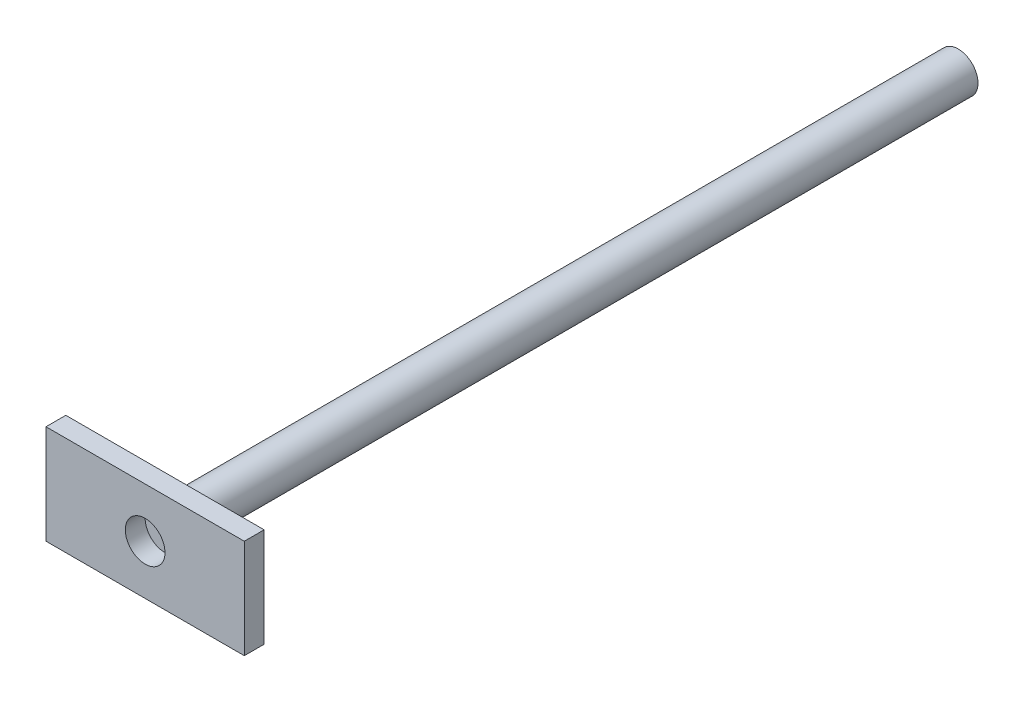
ISO-10303-21;
HEADER;
FILE_DESCRIPTION(('STEP AP214'),'2;1');
FILE_NAME('part.step','',(''),(''),'','','');
FILE_SCHEMA(('AUTOMOTIVE_DESIGN { 1 0 10303 214 1 1 1 1 }'));
ENDSEC;
DATA;
#1=APPLICATION_CONTEXT('core data for automotive mechanical design processes');
#2=APPLICATION_PROTOCOL_DEFINITION('international standard','automotive_design',2000,#1);
#3=PRODUCT_CONTEXT('',#1,'mechanical');
#4=PRODUCT('Part','Part','',(#3));
#5=PRODUCT_RELATED_PRODUCT_CATEGORY('part','',(#4));
#6=PRODUCT_DEFINITION_FORMATION('','',#4);
#7=PRODUCT_DEFINITION_CONTEXT('part definition',#1,'design');
#8=PRODUCT_DEFINITION('design','',#6,#7);
#9=PRODUCT_DEFINITION_SHAPE('','',#8);
#10=(LENGTH_UNIT() NAMED_UNIT(*) SI_UNIT(.MILLI.,.METRE.));
#11=(NAMED_UNIT(*) PLANE_ANGLE_UNIT() SI_UNIT($,.RADIAN.));
#12=(NAMED_UNIT(*) SI_UNIT($,.STERADIAN.) SOLID_ANGLE_UNIT());
#13=UNCERTAINTY_MEASURE_WITH_UNIT(LENGTH_MEASURE(1.E-05),#10,'distance_accuracy_value','');
#14=(GEOMETRIC_REPRESENTATION_CONTEXT(3) GLOBAL_UNCERTAINTY_ASSIGNED_CONTEXT((#13)) GLOBAL_UNIT_ASSIGNED_CONTEXT((#10,
#11,#12)) REPRESENTATION_CONTEXT('',''));
#15=CARTESIAN_POINT('',(0.,0.,0.));
#16=DIRECTION('',(0.,0.,1.));
#17=DIRECTION('',(1.,0.,0.));
#18=AXIS2_PLACEMENT_3D('',#15,#16,#17);
#19=CARTESIAN_POINT('',(-50.,25.,410.));
#20=DIRECTION('',(0.,0.,1.));
#21=DIRECTION('',(1.,0.,0.));
#22=AXIS2_PLACEMENT_3D('',#19,#20,#21);
#23=PLANE('',#22);
#24=DIRECTION('',(0.,-1.,0.));
#25=VECTOR('',#24,1.);
#26=CARTESIAN_POINT('',(-50.,-25.,410.));
#27=LINE('',#26,#25);
#28=CARTESIAN_POINT('',(-50.,25.,410.));
#29=VERTEX_POINT('',#28);
#30=CARTESIAN_POINT('',(-50.,-25.,410.));
#31=VERTEX_POINT('',#30);
#32=EDGE_CURVE('E92',#29,#31,#27,.T.);
#33=ORIENTED_EDGE('',*,*,#32,.T.);
#34=DIRECTION('',(1.,0.,0.));
#35=VECTOR('',#34,1.);
#36=CARTESIAN_POINT('',(50.,-25.,410.));
#37=LINE('',#36,#35);
#38=CARTESIAN_POINT('',(50.,-25.,410.));
#39=VERTEX_POINT('',#38);
#40=EDGE_CURVE('E87',#31,#39,#37,.T.);
#41=ORIENTED_EDGE('',*,*,#40,.T.);
#42=DIRECTION('',(0.,1.,0.));
#43=VECTOR('',#42,1.);
#44=CARTESIAN_POINT('',(50.,-25.,410.));
#45=LINE('',#44,#43);
#46=CARTESIAN_POINT('',(50.,25.,410.));
#47=VERTEX_POINT('',#46);
#48=EDGE_CURVE('E90',#39,#47,#45,.T.);
#49=ORIENTED_EDGE('',*,*,#48,.T.);
#50=DIRECTION('',(-1.,0.,0.));
#51=VECTOR('',#50,1.);
#52=CARTESIAN_POINT('',(50.,25.,410.));
#53=LINE('',#52,#51);
#54=EDGE_CURVE('E57',#47,#29,#53,.T.);
#55=ORIENTED_EDGE('',*,*,#54,.T.);
#56=EDGE_LOOP('',(#33,#41,#49,#55));
#57=FACE_BOUND('',#56,.T.);
#58=CARTESIAN_POINT('',(0.,0.,410.));
#59=DIRECTION('',(0.,0.,1.));
#60=DIRECTION('',(1.,0.,0.));
#61=AXIS2_PLACEMENT_3D('',#58,#59,#60);
#62=CIRCLE('',#61,9.99999999999999);
#63=CARTESIAN_POINT('',(9.99999999999999,0.,410.));
#64=VERTEX_POINT('',#63);
#65=EDGE_CURVE('E107',#64,#64,#62,.T.);
#66=ORIENTED_EDGE('',*,*,#65,.F.);
#67=EDGE_LOOP('',(#66));
#68=FACE_BOUND('',#67,.T.);
#69=ADVANCED_FACE('F40',(#57,#68),#23,.T.);
#70=CARTESIAN_POINT('',(-50.,25.,400.));
#71=DIRECTION('',(0.,0.,1.));
#72=DIRECTION('',(1.,0.,0.));
#73=AXIS2_PLACEMENT_3D('',#70,#71,#72);
#74=PLANE('',#73);
#75=DIRECTION('',(0.,-1.,0.));
#76=VECTOR('',#75,1.);
#77=CARTESIAN_POINT('',(-50.,-25.,400.));
#78=LINE('',#77,#76);
#79=CARTESIAN_POINT('',(-50.,25.,400.));
#80=VERTEX_POINT('',#79);
#81=CARTESIAN_POINT('',(-50.,-25.,400.));
#82=VERTEX_POINT('',#81);
#83=EDGE_CURVE('E104',#80,#82,#78,.T.);
#84=ORIENTED_EDGE('',*,*,#83,.F.);
#85=DIRECTION('',(-1.,0.,0.));
#86=VECTOR('',#85,1.);
#87=CARTESIAN_POINT('',(50.,25.,400.));
#88=LINE('',#87,#86);
#89=CARTESIAN_POINT('',(50.,25.,400.));
#90=VERTEX_POINT('',#89);
#91=EDGE_CURVE('E80',#90,#80,#88,.T.);
#92=ORIENTED_EDGE('',*,*,#91,.F.);
#93=DIRECTION('',(0.,1.,0.));
#94=VECTOR('',#93,1.);
#95=CARTESIAN_POINT('',(50.,-25.,400.));
#96=LINE('',#95,#94);
#97=CARTESIAN_POINT('',(50.,-25.,400.));
#98=VERTEX_POINT('',#97);
#99=EDGE_CURVE('E74',#98,#90,#96,.T.);
#100=ORIENTED_EDGE('',*,*,#99,.F.);
#101=DIRECTION('',(1.,0.,0.));
#102=VECTOR('',#101,1.);
#103=CARTESIAN_POINT('',(50.,-25.,400.));
#104=LINE('',#103,#102);
#105=EDGE_CURVE('E96',#82,#98,#104,.T.);
#106=ORIENTED_EDGE('',*,*,#105,.F.);
#107=EDGE_LOOP('',(#84,#92,#100,#106));
#108=FACE_BOUND('',#107,.T.);
#109=CARTESIAN_POINT('',(0.,0.,400.));
#110=DIRECTION('',(0.,0.,1.));
#111=DIRECTION('',(1.,0.,0.));
#112=AXIS2_PLACEMENT_3D('',#109,#110,#111);
#113=CIRCLE('',#112,9.99999999999999);
#114=CARTESIAN_POINT('',(9.99999999999999,0.,400.));
#115=VERTEX_POINT('',#114);
#116=EDGE_CURVE('E119',#115,#115,#113,.T.);
#117=ORIENTED_EDGE('',*,*,#116,.T.);
#118=EDGE_LOOP('',(#117));
#119=FACE_BOUND('',#118,.T.);
#120=ADVANCED_FACE('F115',(#108,#119),#74,.F.);
#121=CARTESIAN_POINT('',(-50.,-25.,410.));
#122=DIRECTION('',(1.,0.,0.));
#123=DIRECTION('',(0.,0.,-1.));
#124=AXIS2_PLACEMENT_3D('',#121,#122,#123);
#125=PLANE('',#124);
#126=ORIENTED_EDGE('',*,*,#83,.T.);
#127=DIRECTION('',(0.,0.,-1.));
#128=VECTOR('',#127,1.);
#129=CARTESIAN_POINT('',(-50.,-25.,410.));
#130=LINE('',#129,#128);
#131=EDGE_CURVE('E12',#31,#82,#130,.T.);
#132=ORIENTED_EDGE('',*,*,#131,.F.);
#133=ORIENTED_EDGE('',*,*,#32,.F.);
#134=DIRECTION('',(0.,0.,-1.));
#135=VECTOR('',#134,1.);
#136=CARTESIAN_POINT('',(-50.,25.,410.));
#137=LINE('',#136,#135);
#138=EDGE_CURVE('E100',#29,#80,#137,.T.);
#139=ORIENTED_EDGE('',*,*,#138,.T.);
#140=EDGE_LOOP('',(#126,#132,#133,#139));
#141=FACE_BOUND('',#140,.T.);
#142=ADVANCED_FACE('F42',(#141),#125,.F.);
#143=CARTESIAN_POINT('',(50.,-25.,410.));
#144=DIRECTION('',(0.,1.,0.));
#145=DIRECTION('',(-1.,0.,0.));
#146=AXIS2_PLACEMENT_3D('',#143,#144,#145);
#147=PLANE('',#146);
#148=ORIENTED_EDGE('',*,*,#105,.T.);
#149=DIRECTION('',(0.,0.,-1.));
#150=VECTOR('',#149,1.);
#151=CARTESIAN_POINT('',(50.,-25.,410.));
#152=LINE('',#151,#150);
#153=EDGE_CURVE('E49',#39,#98,#152,.T.);
#154=ORIENTED_EDGE('',*,*,#153,.F.);
#155=ORIENTED_EDGE('',*,*,#40,.F.);
#156=ORIENTED_EDGE('',*,*,#131,.T.);
#157=EDGE_LOOP('',(#148,#154,#155,#156));
#158=FACE_BOUND('',#157,.T.);
#159=ADVANCED_FACE('F95',(#158),#147,.F.);
#160=CARTESIAN_POINT('',(50.,-25.,410.));
#161=DIRECTION('',(-1.,0.,0.));
#162=DIRECTION('',(0.,0.,1.));
#163=AXIS2_PLACEMENT_3D('',#160,#161,#162);
#164=PLANE('',#163);
#165=ORIENTED_EDGE('',*,*,#99,.T.);
#166=DIRECTION('',(0.,0.,-1.));
#167=VECTOR('',#166,1.);
#168=CARTESIAN_POINT('',(50.,25.,410.));
#169=LINE('',#168,#167);
#170=EDGE_CURVE('E97',#47,#90,#169,.T.);
#171=ORIENTED_EDGE('',*,*,#170,.F.);
#172=ORIENTED_EDGE('',*,*,#48,.F.);
#173=ORIENTED_EDGE('',*,*,#153,.T.);
#174=EDGE_LOOP('',(#165,#171,#172,#173));
#175=FACE_BOUND('',#174,.T.);
#176=ADVANCED_FACE('F98',(#175),#164,.F.);
#177=CARTESIAN_POINT('',(50.,25.,410.));
#178=DIRECTION('',(0.,-1.,0.));
#179=DIRECTION('',(1.,0.,0.));
#180=AXIS2_PLACEMENT_3D('',#177,#178,#179);
#181=PLANE('',#180);
#182=ORIENTED_EDGE('',*,*,#91,.T.);
#183=ORIENTED_EDGE('',*,*,#138,.F.);
#184=ORIENTED_EDGE('',*,*,#54,.F.);
#185=ORIENTED_EDGE('',*,*,#170,.T.);
#186=EDGE_LOOP('',(#182,#183,#184,#185));
#187=FACE_BOUND('',#186,.T.);
#188=ADVANCED_FACE('F112',(#187),#181,.F.);
#189=CARTESIAN_POINT('',(0.,0.,410.));
#190=DIRECTION('',(0.,0.,-1.));
#191=DIRECTION('',(-1.,0.,0.));
#192=AXIS2_PLACEMENT_3D('',#189,#190,#191);
#193=CYLINDRICAL_SURFACE('',#192,9.99999999999999);
#194=ORIENTED_EDGE('',*,*,#65,.T.);
#195=EDGE_LOOP('',(#194));
#196=FACE_BOUND('',#195,.T.);
#197=ORIENTED_EDGE('',*,*,#116,.F.);
#198=EDGE_LOOP('',(#197));
#199=FACE_BOUND('',#198,.T.);
#200=ADVANCED_FACE('F125',(#196,#199),#193,.F.);
#201=CLOSED_SHELL('',(#69,#120,#142,#159,#176,#188,#200));
#202=MANIFOLD_SOLID_BREP('B2',#201);
#203=CARTESIAN_POINT('',(0.,0.,400.));
#204=DIRECTION('',(0.,0.,-1.));
#205=DIRECTION('',(-1.,0.,0.));
#206=AXIS2_PLACEMENT_3D('',#203,#204,#205);
#207=CYLINDRICAL_SURFACE('',#206,10.);
#208=CARTESIAN_POINT('',(0.,0.,400.));
#209=DIRECTION('',(0.,0.,1.));
#210=DIRECTION('',(1.,0.,0.));
#211=AXIS2_PLACEMENT_3D('',#208,#209,#210);
#212=CIRCLE('',#211,10.);
#213=CARTESIAN_POINT('',(10.,0.,400.));
#214=VERTEX_POINT('',#213);
#215=EDGE_CURVE('E39',#214,#214,#212,.T.);
#216=ORIENTED_EDGE('',*,*,#215,.F.);
#217=EDGE_LOOP('',(#216));
#218=FACE_BOUND('',#217,.T.);
#219=CARTESIAN_POINT('',(0.,0.,0.));
#220=DIRECTION('',(0.,0.,1.));
#221=DIRECTION('',(1.,0.,0.));
#222=AXIS2_PLACEMENT_3D('',#219,#220,#221);
#223=CIRCLE('',#222,10.);
#224=CARTESIAN_POINT('',(10.,0.,0.));
#225=VERTEX_POINT('',#224);
#226=EDGE_CURVE('E187',#225,#225,#223,.T.);
#227=ORIENTED_EDGE('',*,*,#226,.T.);
#228=EDGE_LOOP('',(#227));
#229=FACE_BOUND('',#228,.T.);
#230=ADVANCED_FACE('F184',(#218,#229),#207,.T.);
#231=CARTESIAN_POINT('',(0.,0.,400.));
#232=DIRECTION('',(0.,0.,1.));
#233=DIRECTION('',(1.,0.,0.));
#234=AXIS2_PLACEMENT_3D('',#231,#232,#233);
#235=PLANE('',#234);
#236=ORIENTED_EDGE('',*,*,#215,.T.);
#237=EDGE_LOOP('',(#236));
#238=FACE_BOUND('',#237,.T.);
#239=ADVANCED_FACE('F199',(#238),#235,.T.);
#240=CARTESIAN_POINT('',(0.,0.,0.));
#241=DIRECTION('',(0.,0.,1.));
#242=DIRECTION('',(1.,0.,0.));
#243=AXIS2_PLACEMENT_3D('',#240,#241,#242);
#244=PLANE('',#243);
#245=ORIENTED_EDGE('',*,*,#226,.F.);
#246=EDGE_LOOP('',(#245));
#247=FACE_BOUND('',#246,.T.);
#248=ADVANCED_FACE('F197',(#247),#244,.F.);
#249=CLOSED_SHELL('',(#230,#239,#248));
#250=MANIFOLD_SOLID_BREP('B6',#249);
#251=ADVANCED_BREP_SHAPE_REPRESENTATION('',(#18,#202,#250),#14);
#252=SHAPE_DEFINITION_REPRESENTATION(#9,#251);
ENDSEC;
END-ISO-10303-21;
